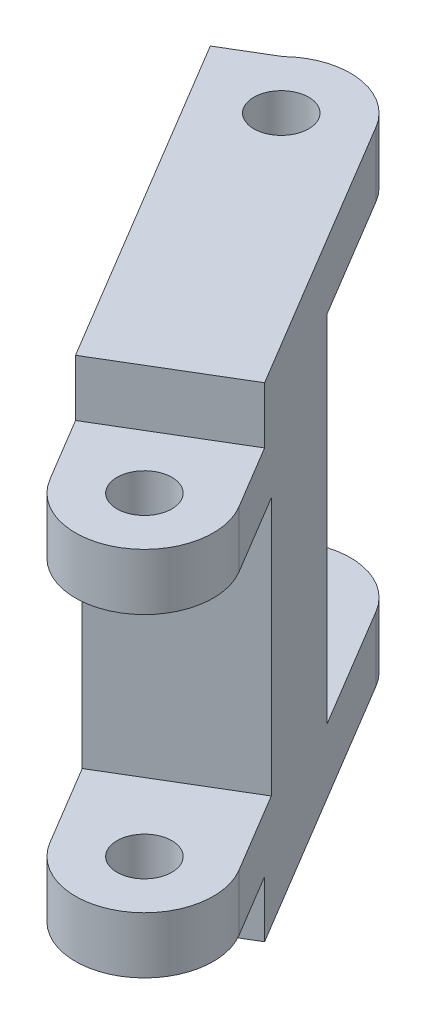
ISO-10303-21;
HEADER;
FILE_DESCRIPTION(('STEP AP214'),'2;1');
FILE_NAME('part.step','',(''),(''),'','','');
FILE_SCHEMA(('AUTOMOTIVE_DESIGN { 1 0 10303 214 1 1 1 1 }'));
ENDSEC;
DATA;
#1=APPLICATION_CONTEXT('core data for automotive mechanical design processes');
#2=APPLICATION_PROTOCOL_DEFINITION('international standard','automotive_design',2000,#1);
#3=PRODUCT_CONTEXT('',#1,'mechanical');
#4=PRODUCT('Part','Part','',(#3));
#5=PRODUCT_RELATED_PRODUCT_CATEGORY('part','',(#4));
#6=PRODUCT_DEFINITION_FORMATION('','',#4);
#7=PRODUCT_DEFINITION_CONTEXT('part definition',#1,'design');
#8=PRODUCT_DEFINITION('design','',#6,#7);
#9=PRODUCT_DEFINITION_SHAPE('','',#8);
#10=(LENGTH_UNIT() NAMED_UNIT(*) SI_UNIT(.MILLI.,.METRE.));
#11=(NAMED_UNIT(*) PLANE_ANGLE_UNIT() SI_UNIT($,.RADIAN.));
#12=(NAMED_UNIT(*) SI_UNIT($,.STERADIAN.) SOLID_ANGLE_UNIT());
#13=UNCERTAINTY_MEASURE_WITH_UNIT(LENGTH_MEASURE(1.E-05),#10,'distance_accuracy_value','');
#14=(GEOMETRIC_REPRESENTATION_CONTEXT(3) GLOBAL_UNCERTAINTY_ASSIGNED_CONTEXT((#13)) GLOBAL_UNIT_ASSIGNED_CONTEXT((#10,
#11,#12)) REPRESENTATION_CONTEXT('',''));
#15=CARTESIAN_POINT('',(0.,0.,0.));
#16=DIRECTION('',(0.,0.,1.));
#17=DIRECTION('',(1.,0.,0.));
#18=AXIS2_PLACEMENT_3D('',#15,#16,#17);
#19=CARTESIAN_POINT('',(-3.11840054835048,30.,-44.5812672091987));
#20=DIRECTION('',(0.,-1.,0.));
#21=DIRECTION('',(0.,0.,-1.));
#22=AXIS2_PLACEMENT_3D('',#19,#20,#21);
#23=CYLINDRICAL_SURFACE('',#22,1.7);
#24=CARTESIAN_POINT('',(-3.11840054835048,26.5,-44.5812672091987));
#25=DIRECTION('',(0.,-1.,0.));
#26=DIRECTION('',(0.,0.,-1.));
#27=AXIS2_PLACEMENT_3D('',#24,#25,#26);
#28=CIRCLE('',#27,1.7);
#29=CARTESIAN_POINT('',(-3.11840054835048,26.5,-46.2812672091987));
#30=VERTEX_POINT('',#29);
#31=EDGE_CURVE('E186',#30,#30,#28,.T.);
#32=ORIENTED_EDGE('',*,*,#31,.F.);
#33=EDGE_LOOP('',(#32));
#34=FACE_BOUND('',#33,.T.);
#35=CARTESIAN_POINT('',(-3.11840054835048,23.,-44.5812672091987));
#36=DIRECTION('',(0.,1.,0.));
#37=DIRECTION('',(0.,0.,1.));
#38=AXIS2_PLACEMENT_3D('',#35,#36,#37);
#39=CIRCLE('',#38,1.7);
#40=CARTESIAN_POINT('',(-3.11840054835048,23.,-42.8812672091987));
#41=VERTEX_POINT('',#40);
#42=EDGE_CURVE('E226',#41,#41,#39,.T.);
#43=ORIENTED_EDGE('',*,*,#42,.F.);
#44=EDGE_LOOP('',(#43));
#45=FACE_BOUND('',#44,.T.);
#46=ADVANCED_FACE('F37',(#34,#45),#23,.F.);
#47=CARTESIAN_POINT('',(-3.11840054835048,30.,-44.5812672091987));
#48=DIRECTION('',(0.,-1.,0.));
#49=DIRECTION('',(0.,0.,-1.));
#50=AXIS2_PLACEMENT_3D('',#47,#48,#49);
#51=CYLINDRICAL_SURFACE('',#50,4.27118158012899);
#52=DIRECTION('',(0.,-1.,0.));
#53=VECTOR('',#52,1.);
#54=CARTESIAN_POINT('',(0.547347337405798,30.,-46.7733631305731));
#55=LINE('',#54,#53);
#56=CARTESIAN_POINT('',(0.547347337405801,26.5,-46.7733631305731));
#57=VERTEX_POINT('',#56);
#58=CARTESIAN_POINT('',(0.547347337405799,23.,-46.7733631305731));
#59=VERTEX_POINT('',#58);
#60=EDGE_CURVE('E291',#57,#59,#55,.T.);
#61=ORIENTED_EDGE('',*,*,#60,.F.);
#62=CARTESIAN_POINT('',(-3.11840054835048,26.5,-44.5812672091987));
#63=DIRECTION('',(0.,-1.,0.));
#64=DIRECTION('',(0.,0.,-1.));
#65=AXIS2_PLACEMENT_3D('',#62,#63,#64);
#66=CIRCLE('',#65,4.27118158012899);
#67=CARTESIAN_POINT('',(-6.78414843410676,26.5,-42.3891712878242));
#68=VERTEX_POINT('',#67);
#69=EDGE_CURVE('E184',#57,#68,#66,.T.);
#70=ORIENTED_EDGE('',*,*,#69,.T.);
#71=DIRECTION('',(0.,-1.,0.));
#72=VECTOR('',#71,1.);
#73=CARTESIAN_POINT('',(-6.78414843410676,30.,-42.3891712878242));
#74=LINE('',#73,#72);
#75=CARTESIAN_POINT('',(-6.78414843410676,23.,-42.3891712878242));
#76=VERTEX_POINT('',#75);
#77=EDGE_CURVE('E179',#68,#76,#74,.T.);
#78=ORIENTED_EDGE('',*,*,#77,.T.);
#79=CARTESIAN_POINT('',(-3.11840054835048,23.,-44.5812672091987));
#80=DIRECTION('',(0.,1.,0.));
#81=DIRECTION('',(0.,0.,1.));
#82=AXIS2_PLACEMENT_3D('',#79,#80,#81);
#83=CIRCLE('',#82,4.27118158012899);
#84=EDGE_CURVE('E314',#76,#59,#83,.T.);
#85=ORIENTED_EDGE('',*,*,#84,.T.);
#86=EDGE_LOOP('',(#61,#70,#78,#85));
#87=FACE_BOUND('',#86,.T.);
#88=ADVANCED_FACE('F399',(#87),#51,.T.);
#89=CARTESIAN_POINT('',(-15.7737708009403,30.,-65.7176303802829));
#90=DIRECTION('',(0.,-1.,0.));
#91=DIRECTION('',(0.,0.,-1.));
#92=AXIS2_PLACEMENT_3D('',#89,#90,#91);
#93=CYLINDRICAL_SURFACE('',#92,4.2848689511232);
#94=CARTESIAN_POINT('',(-15.7737708009403,26.,-65.7176303802829));
#95=DIRECTION('',(0.,-1.,0.));
#96=DIRECTION('',(0.,0.,-1.));
#97=AXIS2_PLACEMENT_3D('',#94,#95,#96);
#98=CIRCLE('',#97,4.2848689511232);
#99=CARTESIAN_POINT('',(-18.7462358249816,26.,-68.8038179327739));
#100=VERTEX_POINT('',#99);
#101=CARTESIAN_POINT('',(-12.0962757088566,26.,-67.9167510627376));
#102=VERTEX_POINT('',#101);
#103=EDGE_CURVE('E249',#100,#102,#98,.T.);
#104=ORIENTED_EDGE('',*,*,#103,.F.);
#105=DIRECTION('',(0.,-1.,0.));
#106=VECTOR('',#105,1.);
#107=CARTESIAN_POINT('',(-18.7462358249816,30.,-68.8038179327739));
#108=LINE('',#107,#106);
#109=CARTESIAN_POINT('',(-18.7462358249816,30.,-68.8038179327739));
#110=VERTEX_POINT('',#109);
#111=EDGE_CURVE('E300',#110,#100,#108,.T.);
#112=ORIENTED_EDGE('',*,*,#111,.F.);
#113=CARTESIAN_POINT('',(-15.7737708009403,30.,-65.7176303802829));
#114=DIRECTION('',(0.,1.,0.));
#115=DIRECTION('',(0.,0.,1.));
#116=AXIS2_PLACEMENT_3D('',#113,#114,#115);
#117=CIRCLE('',#116,4.2848689511232);
#118=CARTESIAN_POINT('',(-12.0962757088566,30.,-67.9167510627376));
#119=VERTEX_POINT('',#118);
#120=EDGE_CURVE('E272',#119,#110,#117,.T.);
#121=ORIENTED_EDGE('',*,*,#120,.F.);
#122=DIRECTION('',(0.,-1.,0.));
#123=VECTOR('',#122,1.);
#124=CARTESIAN_POINT('',(-12.0962757088566,30.,-67.9167510627376));
#125=LINE('',#124,#123);
#126=EDGE_CURVE('E304',#119,#102,#125,.T.);
#127=ORIENTED_EDGE('',*,*,#126,.T.);
#128=EDGE_LOOP('',(#104,#112,#121,#127));
#129=FACE_BOUND('',#128,.T.);
#130=ADVANCED_FACE('F371',(#129),#93,.T.);
#131=CARTESIAN_POINT('',(-35.2445386971406,30.,-58.9379287437799));
#132=DIRECTION('',(-0.513229391036159,0.,-0.858251473739867));
#133=DIRECTION('',(-0.858251473739867,0.,0.513229391036159));
#134=AXIS2_PLACEMENT_3D('',#131,#132,#133);
#135=PLANE('',#134);
#136=ORIENTED_EDGE('',*,*,#111,.T.);
#137=DIRECTION('',(-0.858251473739867,0.,0.513229391036159));
#138=VECTOR('',#137,1.);
#139=CARTESIAN_POINT('',(-35.2445386971406,26.,-58.9379287437799));
#140=LINE('',#139,#138);
#141=CARTESIAN_POINT('',(-21.5701353963567,26.,-67.1151424085145));
#142=VERTEX_POINT('',#141);
#143=EDGE_CURVE('E246',#100,#142,#140,.T.);
#144=ORIENTED_EDGE('',*,*,#143,.T.);
#145=DIRECTION('',(0.,-1.,0.));
#146=VECTOR('',#145,1.);
#147=CARTESIAN_POINT('',(-21.5701353963567,30.,-67.1151424085144));
#148=LINE('',#147,#146);
#149=CARTESIAN_POINT('',(-21.5701353963567,30.,-67.1151424085144));
#150=VERTEX_POINT('',#149);
#151=EDGE_CURVE('E296',#150,#142,#148,.T.);
#152=ORIENTED_EDGE('',*,*,#151,.F.);
#153=DIRECTION('',(0.858251473739867,0.,-0.513229391036159));
#154=VECTOR('',#153,1.);
#155=CARTESIAN_POINT('',(-35.2445386971406,30.,-58.9379287437799));
#156=LINE('',#155,#154);
#157=EDGE_CURVE('E274',#150,#110,#156,.T.);
#158=ORIENTED_EDGE('',*,*,#157,.T.);
#159=EDGE_LOOP('',(#136,#144,#152,#158));
#160=FACE_BOUND('',#159,.T.);
#161=ADVANCED_FACE('F366',(#160),#135,.T.);
#162=CARTESIAN_POINT('',(-15.7737708009403,30.,-65.7176303802829));
#163=DIRECTION('',(0.,-1.,0.));
#164=DIRECTION('',(0.,0.,-1.));
#165=AXIS2_PLACEMENT_3D('',#162,#163,#164);
#166=CYLINDRICAL_SURFACE('',#165,1.7);
#167=CARTESIAN_POINT('',(-15.7737708009403,30.,-65.7176303802829));
#168=DIRECTION('',(0.,1.,0.));
#169=DIRECTION('',(0.,0.,1.));
#170=AXIS2_PLACEMENT_3D('',#167,#168,#169);
#171=CIRCLE('',#170,1.7);
#172=CARTESIAN_POINT('',(-15.7737708009403,30.,-64.0176303802829));
#173=VERTEX_POINT('',#172);
#174=EDGE_CURVE('E266',#173,#173,#171,.T.);
#175=ORIENTED_EDGE('',*,*,#174,.T.);
#176=EDGE_LOOP('',(#175));
#177=FACE_BOUND('',#176,.T.);
#178=CARTESIAN_POINT('',(-15.7737708009403,26.,-65.7176303802829));
#179=DIRECTION('',(0.,-1.,0.));
#180=DIRECTION('',(0.,0.,-1.));
#181=AXIS2_PLACEMENT_3D('',#178,#179,#180);
#182=CIRCLE('',#181,1.7);
#183=CARTESIAN_POINT('',(-15.7737708009403,26.,-67.4176303802829));
#184=VERTEX_POINT('',#183);
#185=EDGE_CURVE('E243',#184,#184,#182,.T.);
#186=ORIENTED_EDGE('',*,*,#185,.T.);
#187=EDGE_LOOP('',(#186));
#188=FACE_BOUND('',#187,.T.);
#189=ADVANCED_FACE('F381',(#177,#188),#166,.F.);
#190=CARTESIAN_POINT('',(21.0058990722965,30.,-12.5614055074834));
#191=DIRECTION('',(-0.858251473739867,0.,0.513229391036159));
#192=DIRECTION('',(0.513229391036159,0.,0.858251473739867));
#193=AXIS2_PLACEMENT_3D('',#190,#191,#192);
#194=PLANE('',#193);
#195=DIRECTION('',(0.,-1.,0.));
#196=VECTOR('',#195,1.);
#197=CARTESIAN_POINT('',(-1.81775136478792,30.,-50.7284161383519));
#198=LINE('',#197,#196);
#199=CARTESIAN_POINT('',(-1.81775136478792,30.,-50.7284161383519));
#200=VERTEX_POINT('',#199);
#201=CARTESIAN_POINT('',(-1.81775136478792,26.5,-50.7284161383519));
#202=VERTEX_POINT('',#201);
#203=EDGE_CURVE('E51',#200,#202,#198,.T.);
#204=ORIENTED_EDGE('',*,*,#203,.T.);
#205=DIRECTION('',(0.513229391036159,0.,0.858251473739867));
#206=VECTOR('',#205,1.);
#207=CARTESIAN_POINT('',(21.0058990722965,26.5,-12.5614055074834));
#208=LINE('',#207,#206);
#209=EDGE_CURVE('E168',#202,#57,#208,.T.);
#210=ORIENTED_EDGE('',*,*,#209,.T.);
#211=ORIENTED_EDGE('',*,*,#60,.T.);
#212=DIRECTION('',(-0.513229391036159,0.,-0.858251473739867));
#213=VECTOR('',#212,1.);
#214=CARTESIAN_POINT('',(21.0058990722965,23.,-12.5614055074834));
#215=LINE('',#214,#213);
#216=CARTESIAN_POINT('',(-2.43436363101253,23.,-51.7595503552464));
#217=VERTEX_POINT('',#216);
#218=EDGE_CURVE('E223',#59,#217,#215,.T.);
#219=ORIENTED_EDGE('',*,*,#218,.T.);
#220=DIRECTION('',(0.,-1.,0.));
#221=VECTOR('',#220,1.);
#222=CARTESIAN_POINT('',(-2.43436363101253,30.,-51.7595503552464));
#223=LINE('',#222,#221);
#224=CARTESIAN_POINT('',(-2.43436363101253,7.,-51.7595503552464));
#225=VERTEX_POINT('',#224);
#226=EDGE_CURVE('E229',#217,#225,#223,.T.);
#227=ORIENTED_EDGE('',*,*,#226,.T.);
#228=DIRECTION('',(0.513229391036159,0.,0.858251473739867));
#229=VECTOR('',#228,1.);
#230=CARTESIAN_POINT('',(21.0058990722965,7.,-12.5614055074834));
#231=LINE('',#230,#229);
#232=CARTESIAN_POINT('',(0.547347337405799,7.,-46.7733631305731));
#233=VERTEX_POINT('',#232);
#234=EDGE_CURVE('E216',#225,#233,#231,.T.);
#235=ORIENTED_EDGE('',*,*,#234,.T.);
#236=CARTESIAN_POINT('',(0.547347337405794,3.5,-46.7733631305731));
#237=VERTEX_POINT('',#236);
#238=EDGE_CURVE('E279',#233,#237,#55,.T.);
#239=ORIENTED_EDGE('',*,*,#238,.T.);
#240=DIRECTION('',(0.513229391036158,0.,0.858251473739867));
#241=VECTOR('',#240,1.);
#242=CARTESIAN_POINT('',(3.39102063143032,3.5,-42.0180103817682));
#243=LINE('',#242,#241);
#244=CARTESIAN_POINT('',(-1.81775136478791,3.5,-50.7284161383518));
#245=VERTEX_POINT('',#244);
#246=EDGE_CURVE('E190',#245,#237,#243,.T.);
#247=ORIENTED_EDGE('',*,*,#246,.F.);
#248=DIRECTION('',(0.,-1.,0.));
#249=VECTOR('',#248,1.);
#250=CARTESIAN_POINT('',(-1.81775136478791,3.5,-50.7284161383518));
#251=LINE('',#250,#249);
#252=CARTESIAN_POINT('',(-1.81775136478791,0.,-50.7284161383518));
#253=VERTEX_POINT('',#252);
#254=EDGE_CURVE('E198',#245,#253,#251,.T.);
#255=ORIENTED_EDGE('',*,*,#254,.T.);
#256=DIRECTION('',(-0.513229391036159,0.,-0.858251473739867));
#257=VECTOR('',#256,1.);
#258=CARTESIAN_POINT('',(21.0058990722965,0.,-12.5614055074834));
#259=LINE('',#258,#257);
#260=CARTESIAN_POINT('',(-12.0962757088566,0.,-67.9167510627376));
#261=VERTEX_POINT('',#260);
#262=EDGE_CURVE('E282',#253,#261,#259,.T.);
#263=ORIENTED_EDGE('',*,*,#262,.T.);
#264=CARTESIAN_POINT('',(-12.0962757088566,4.,-67.9167510627376));
#265=VERTEX_POINT('',#264);
#266=EDGE_CURVE('E303',#265,#261,#125,.T.);
#267=ORIENTED_EDGE('',*,*,#266,.F.);
#268=DIRECTION('',(0.513229391036159,0.,0.858251473739867));
#269=VECTOR('',#268,1.);
#270=CARTESIAN_POINT('',(21.0058990722965,4.,-12.5614055074834));
#271=LINE('',#270,#269);
#272=CARTESIAN_POINT('',(-7.5666575413741,4.,-60.3420650926451));
#273=VERTEX_POINT('',#272);
#274=EDGE_CURVE('E259',#265,#273,#271,.T.);
#275=ORIENTED_EDGE('',*,*,#274,.T.);
#276=DIRECTION('',(0.,1.,0.));
#277=VECTOR('',#276,1.);
#278=CARTESIAN_POINT('',(-7.56665754137411,30.,-60.3420650926451));
#279=LINE('',#278,#277);
#280=CARTESIAN_POINT('',(-7.5666575413741,26.,-60.3420650926451));
#281=VERTEX_POINT('',#280);
#282=EDGE_CURVE('E262',#273,#281,#279,.T.);
#283=ORIENTED_EDGE('',*,*,#282,.T.);
#284=DIRECTION('',(0.513229391036159,0.,0.858251473739867));
#285=VECTOR('',#284,1.);
#286=CARTESIAN_POINT('',(21.0058990722965,26.,-12.5614055074834));
#287=LINE('',#286,#285);
#288=EDGE_CURVE('E251',#102,#281,#287,.T.);
#289=ORIENTED_EDGE('',*,*,#288,.F.);
#290=ORIENTED_EDGE('',*,*,#126,.F.);
#291=DIRECTION('',(-0.513229391036159,0.,-0.858251473739867));
#292=VECTOR('',#291,1.);
#293=CARTESIAN_POINT('',(21.0058990722965,30.,-12.5614055074834));
#294=LINE('',#293,#292);
#295=EDGE_CURVE('E269',#200,#119,#294,.T.);
#296=ORIENTED_EDGE('',*,*,#295,.F.);
#297=EDGE_LOOP('',(#204,#210,#211,#219,#227,#235,#239,#247,#255,#263,#267,#275,#283,#289,#290,#296));
#298=FACE_BOUND('',#297,.T.);
#299=ADVANCED_FACE('F327',(#298),#194,.F.);
#300=CARTESIAN_POINT('',(-18.7462358249816,4.,-68.8038179327739));
#301=VERTEX_POINT('',#300);
#302=CARTESIAN_POINT('',(-18.7462358249816,0.,-68.8038179327739));
#303=VERTEX_POINT('',#302);
#304=EDGE_CURVE('E299',#301,#303,#108,.T.);
#305=ORIENTED_EDGE('',*,*,#304,.F.);
#306=CARTESIAN_POINT('',(-15.7737708009403,4.,-65.7176303802829));
#307=DIRECTION('',(0.,-1.,0.));
#308=DIRECTION('',(0.,0.,-1.));
#309=AXIS2_PLACEMENT_3D('',#306,#307,#308);
#310=CIRCLE('',#309,4.2848689511232);
#311=EDGE_CURVE('E256',#301,#265,#310,.T.);
#312=ORIENTED_EDGE('',*,*,#311,.T.);
#313=ORIENTED_EDGE('',*,*,#266,.T.);
#314=CARTESIAN_POINT('',(-15.7737708009403,0.,-65.7176303802829));
#315=DIRECTION('',(0.,1.,0.));
#316=DIRECTION('',(0.,0.,1.));
#317=AXIS2_PLACEMENT_3D('',#314,#315,#316);
#318=CIRCLE('',#317,4.2848689511232);
#319=EDGE_CURVE('E284',#261,#303,#318,.T.);
#320=ORIENTED_EDGE('',*,*,#319,.T.);
#321=EDGE_LOOP('',(#305,#312,#313,#320));
#322=FACE_BOUND('',#321,.T.);
#323=ADVANCED_FACE('F348',(#322),#93,.T.);
#324=DIRECTION('',(-0.858251473739867,0.,0.513229391036159));
#325=VECTOR('',#324,1.);
#326=CARTESIAN_POINT('',(-35.2445386971406,4.,-58.9379287437799));
#327=LINE('',#326,#325);
#328=CARTESIAN_POINT('',(-21.5701353963567,4.,-67.1151424085145));
#329=VERTEX_POINT('',#328);
#330=EDGE_CURVE('E254',#301,#329,#327,.T.);
#331=ORIENTED_EDGE('',*,*,#330,.F.);
#332=ORIENTED_EDGE('',*,*,#304,.T.);
#333=DIRECTION('',(0.858251473739867,0.,-0.513229391036159));
#334=VECTOR('',#333,1.);
#335=CARTESIAN_POINT('',(-35.2445386971406,0.,-58.9379287437799));
#336=LINE('',#335,#334);
#337=CARTESIAN_POINT('',(-21.5701353963567,0.,-67.1151424085144));
#338=VERTEX_POINT('',#337);
#339=EDGE_CURVE('E287',#338,#303,#336,.T.);
#340=ORIENTED_EDGE('',*,*,#339,.F.);
#341=EDGE_CURVE('E295',#329,#338,#148,.T.);
#342=ORIENTED_EDGE('',*,*,#341,.F.);
#343=EDGE_LOOP('',(#331,#332,#340,#342));
#344=FACE_BOUND('',#343,.T.);
#345=ADVANCED_FACE('F521',(#344),#135,.T.);
#346=CARTESIAN_POINT('',(13.6744033007839,30.,-8.17721366473448));
#347=DIRECTION('',(-0.858251473739867,0.,0.513229391036159));
#348=DIRECTION('',(0.513229391036159,0.,0.858251473739867));
#349=AXIS2_PLACEMENT_3D('',#346,#347,#348);
#350=PLANE('',#349);
#351=DIRECTION('',(0.513229391036159,0.,0.858251473739867));
#352=VECTOR('',#351,1.);
#353=CARTESIAN_POINT('',(-9.14924713630047,26.5,-46.3442242956029));
#354=LINE('',#353,#352);
#355=CARTESIAN_POINT('',(-9.14924713630047,26.5,-46.3442242956029));
#356=VERTEX_POINT('',#355);
#357=EDGE_CURVE('E165',#356,#68,#354,.T.);
#358=ORIENTED_EDGE('',*,*,#357,.F.);
#359=DIRECTION('',(0.,-1.,0.));
#360=VECTOR('',#359,1.);
#361=CARTESIAN_POINT('',(-9.14924713630047,30.,-46.3442242956029));
#362=LINE('',#361,#360);
#363=CARTESIAN_POINT('',(-9.14924713630047,30.,-46.3442242956029));
#364=VERTEX_POINT('',#363);
#365=EDGE_CURVE('E171',#364,#356,#362,.T.);
#366=ORIENTED_EDGE('',*,*,#365,.F.);
#367=DIRECTION('',(-0.513229391036159,0.,-0.858251473739867));
#368=VECTOR('',#367,1.);
#369=CARTESIAN_POINT('',(13.6744033007839,30.,-8.17721366473448));
#370=LINE('',#369,#368);
#371=EDGE_CURVE('E277',#364,#150,#370,.T.);
#372=ORIENTED_EDGE('',*,*,#371,.T.);
#373=ORIENTED_EDGE('',*,*,#151,.T.);
#374=DIRECTION('',(0.513229391036159,0.,0.858251473739867));
#375=VECTOR('',#374,1.);
#376=CARTESIAN_POINT('',(13.6744033007839,26.,-8.17721366473448));
#377=LINE('',#376,#375);
#378=CARTESIAN_POINT('',(-14.8981533128867,26.,-55.9578732498962));
#379=VERTEX_POINT('',#378);
#380=EDGE_CURVE('E237',#142,#379,#377,.T.);
#381=ORIENTED_EDGE('',*,*,#380,.T.);
#382=DIRECTION('',(0.,1.,0.));
#383=VECTOR('',#382,1.);
#384=CARTESIAN_POINT('',(-14.8981533128867,0.,-55.9578732498962));
#385=LINE('',#384,#383);
#386=CARTESIAN_POINT('',(-14.8981533128867,4.,-55.9578732498962));
#387=VERTEX_POINT('',#386);
#388=EDGE_CURVE('E234',#387,#379,#385,.T.);
#389=ORIENTED_EDGE('',*,*,#388,.F.);
#390=DIRECTION('',(0.513229391036159,0.,0.858251473739867));
#391=VECTOR('',#390,1.);
#392=CARTESIAN_POINT('',(13.6744033007839,4.,-8.17721366473448));
#393=LINE('',#392,#391);
#394=EDGE_CURVE('E232',#329,#387,#393,.T.);
#395=ORIENTED_EDGE('',*,*,#394,.F.);
#396=ORIENTED_EDGE('',*,*,#341,.T.);
#397=DIRECTION('',(-0.513229391036159,0.,-0.858251473739867));
#398=VECTOR('',#397,1.);
#399=CARTESIAN_POINT('',(13.6744033007839,0.,-8.17721366473448));
#400=LINE('',#399,#398);
#401=CARTESIAN_POINT('',(-9.14924713630048,0.,-46.3442242956029));
#402=VERTEX_POINT('',#401);
#403=EDGE_CURVE('E270',#402,#338,#400,.T.);
#404=ORIENTED_EDGE('',*,*,#403,.F.);
#405=DIRECTION('',(0.,-1.,0.));
#406=VECTOR('',#405,1.);
#407=CARTESIAN_POINT('',(-9.14924713630047,3.5,-46.3442242956029));
#408=LINE('',#407,#406);
#409=CARTESIAN_POINT('',(-9.14924713630047,3.5,-46.3442242956029));
#410=VERTEX_POINT('',#409);
#411=EDGE_CURVE('E59',#410,#402,#408,.T.);
#412=ORIENTED_EDGE('',*,*,#411,.F.);
#413=DIRECTION('',(-0.513229391036158,0.,-0.858251473739867));
#414=VECTOR('',#413,1.);
#415=CARTESIAN_POINT('',(-9.14924713630047,3.5,-46.3442242956029));
#416=LINE('',#415,#414);
#417=CARTESIAN_POINT('',(-6.78414843410676,3.5,-42.3891712878242));
#418=VERTEX_POINT('',#417);
#419=EDGE_CURVE('E192',#418,#410,#416,.T.);
#420=ORIENTED_EDGE('',*,*,#419,.F.);
#421=CARTESIAN_POINT('',(-6.78414843410676,7.,-42.3891712878242));
#422=VERTEX_POINT('',#421);
#423=EDGE_CURVE('E293',#422,#418,#74,.T.);
#424=ORIENTED_EDGE('',*,*,#423,.F.);
#425=DIRECTION('',(0.513229391036158,0.,0.858251473739867));
#426=VECTOR('',#425,1.);
#427=CARTESIAN_POINT('',(-9.76585940252509,7.,-47.3753585124975));
#428=LINE('',#427,#426);
#429=CARTESIAN_POINT('',(-9.76585940252509,7.,-47.3753585124975));
#430=VERTEX_POINT('',#429);
#431=EDGE_CURVE('E208',#430,#422,#428,.T.);
#432=ORIENTED_EDGE('',*,*,#431,.F.);
#433=DIRECTION('',(0.,-1.,0.));
#434=VECTOR('',#433,1.);
#435=CARTESIAN_POINT('',(-9.76585940252509,7.,-47.3753585124975));
#436=LINE('',#435,#434);
#437=CARTESIAN_POINT('',(-9.76585940252509,23.,-47.3753585124975));
#438=VERTEX_POINT('',#437);
#439=EDGE_CURVE('E205',#438,#430,#436,.T.);
#440=ORIENTED_EDGE('',*,*,#439,.F.);
#441=DIRECTION('',(-0.513229391036158,0.,-0.858251473739867));
#442=VECTOR('',#441,1.);
#443=CARTESIAN_POINT('',(-9.76585940252509,23.,-47.3753585124975));
#444=LINE('',#443,#442);
#445=EDGE_CURVE('E210',#76,#438,#444,.T.);
#446=ORIENTED_EDGE('',*,*,#445,.F.);
#447=ORIENTED_EDGE('',*,*,#77,.F.);
#448=EDGE_LOOP('',(#358,#366,#372,#373,#381,#389,#395,#396,#404,#412,#420,#424,#432,#440,#446,#447));
#449=FACE_BOUND('',#448,.T.);
#450=ADVANCED_FACE('F177',(#449),#350,.T.);
#451=CARTESIAN_POINT('',(-15.7737708009403,4.,-65.7176303802829));
#452=DIRECTION('',(0.,-1.,0.));
#453=DIRECTION('',(0.,0.,-1.));
#454=AXIS2_PLACEMENT_3D('',#451,#452,#453);
#455=CIRCLE('',#454,1.7);
#456=CARTESIAN_POINT('',(-15.7737708009403,4.,-67.4176303802829));
#457=VERTEX_POINT('',#456);
#458=EDGE_CURVE('E253',#457,#457,#455,.T.);
#459=ORIENTED_EDGE('',*,*,#458,.F.);
#460=EDGE_LOOP('',(#459));
#461=FACE_BOUND('',#460,.T.);
#462=CARTESIAN_POINT('',(-15.7737708009403,0.,-65.7176303802829));
#463=DIRECTION('',(0.,1.,0.));
#464=DIRECTION('',(0.,0.,1.));
#465=AXIS2_PLACEMENT_3D('',#462,#463,#464);
#466=CIRCLE('',#465,1.7);
#467=CARTESIAN_POINT('',(-15.7737708009403,0.,-64.0176303802829));
#468=VERTEX_POINT('',#467);
#469=EDGE_CURVE('E265',#468,#468,#466,.T.);
#470=ORIENTED_EDGE('',*,*,#469,.F.);
#471=EDGE_LOOP('',(#470));
#472=FACE_BOUND('',#471,.T.);
#473=ADVANCED_FACE('F384',(#461,#472),#166,.F.);
#474=CARTESIAN_POINT('',(-3.11840054835048,3.5,-44.5812672091987));
#475=DIRECTION('',(0.,1.,0.));
#476=DIRECTION('',(0.,0.,1.));
#477=AXIS2_PLACEMENT_3D('',#474,#475,#476);
#478=CIRCLE('',#477,1.7);
#479=CARTESIAN_POINT('',(-3.11840054835048,3.5,-42.8812672091987));
#480=VERTEX_POINT('',#479);
#481=EDGE_CURVE('E201',#480,#480,#478,.T.);
#482=ORIENTED_EDGE('',*,*,#481,.F.);
#483=EDGE_LOOP('',(#482));
#484=FACE_BOUND('',#483,.T.);
#485=CARTESIAN_POINT('',(-3.11840054835048,7.,-44.5812672091987));
#486=DIRECTION('',(0.,-1.,0.));
#487=DIRECTION('',(0.,0.,-1.));
#488=AXIS2_PLACEMENT_3D('',#485,#486,#487);
#489=CIRCLE('',#488,1.7);
#490=CARTESIAN_POINT('',(-3.11840054835048,7.,-46.2812672091987));
#491=VERTEX_POINT('',#490);
#492=EDGE_CURVE('E220',#491,#491,#489,.T.);
#493=ORIENTED_EDGE('',*,*,#492,.F.);
#494=EDGE_LOOP('',(#493));
#495=FACE_BOUND('',#494,.T.);
#496=ADVANCED_FACE('F39',(#484,#495),#23,.F.);
#497=ORIENTED_EDGE('',*,*,#423,.T.);
#498=CARTESIAN_POINT('',(-3.11840054835048,3.5,-44.5812672091987));
#499=DIRECTION('',(0.,1.,0.));
#500=DIRECTION('',(0.,0.,1.));
#501=AXIS2_PLACEMENT_3D('',#498,#499,#500);
#502=CIRCLE('',#501,4.27118158012899);
#503=EDGE_CURVE('E45',#418,#237,#502,.T.);
#504=ORIENTED_EDGE('',*,*,#503,.T.);
#505=ORIENTED_EDGE('',*,*,#238,.F.);
#506=CARTESIAN_POINT('',(-3.11840054835048,7.,-44.5812672091987));
#507=DIRECTION('',(0.,-1.,0.));
#508=DIRECTION('',(0.,0.,-1.));
#509=AXIS2_PLACEMENT_3D('',#506,#507,#508);
#510=CIRCLE('',#509,4.27118158012899);
#511=EDGE_CURVE('E307',#233,#422,#510,.T.);
#512=ORIENTED_EDGE('',*,*,#511,.T.);
#513=EDGE_LOOP('',(#497,#504,#505,#512));
#514=FACE_BOUND('',#513,.T.);
#515=ADVANCED_FACE('F321',(#514),#51,.T.);
#516=CARTESIAN_POINT('',(0.,30.,0.));
#517=DIRECTION('',(0.,1.,0.));
#518=DIRECTION('',(0.,0.,1.));
#519=AXIS2_PLACEMENT_3D('',#516,#517,#518);
#520=PLANE('',#519);
#521=DIRECTION('',(-0.858251473739867,0.,0.513229391036159));
#522=VECTOR('',#521,1.);
#523=CARTESIAN_POINT('',(-22.8236504370844,30.,-38.1670106308685));
#524=LINE('',#523,#522);
#525=EDGE_CURVE('E11',#200,#364,#524,.T.);
#526=ORIENTED_EDGE('',*,*,#525,.F.);
#527=ORIENTED_EDGE('',*,*,#295,.T.);
#528=ORIENTED_EDGE('',*,*,#120,.T.);
#529=ORIENTED_EDGE('',*,*,#157,.F.);
#530=ORIENTED_EDGE('',*,*,#371,.F.);
#531=EDGE_LOOP('',(#526,#527,#528,#529,#530));
#532=FACE_BOUND('',#531,.T.);
#533=ORIENTED_EDGE('',*,*,#174,.F.);
#534=EDGE_LOOP('',(#533));
#535=FACE_BOUND('',#534,.T.);
#536=ADVANCED_FACE('F375',(#532,#535),#520,.T.);
#537=CARTESIAN_POINT('',(0.,0.,0.));
#538=DIRECTION('',(0.,1.,0.));
#539=DIRECTION('',(0.,0.,1.));
#540=AXIS2_PLACEMENT_3D('',#537,#538,#539);
#541=PLANE('',#540);
#542=ORIENTED_EDGE('',*,*,#469,.T.);
#543=EDGE_LOOP('',(#542));
#544=FACE_BOUND('',#543,.T.);
#545=ORIENTED_EDGE('',*,*,#262,.F.);
#546=DIRECTION('',(0.858251473739867,0.,-0.513229391036158));
#547=VECTOR('',#546,1.);
#548=CARTESIAN_POINT('',(-1.81775136478791,0.,-50.7284161383518));
#549=LINE('',#548,#547);
#550=EDGE_CURVE('E189',#402,#253,#549,.T.);
#551=ORIENTED_EDGE('',*,*,#550,.F.);
#552=ORIENTED_EDGE('',*,*,#403,.T.);
#553=ORIENTED_EDGE('',*,*,#339,.T.);
#554=ORIENTED_EDGE('',*,*,#319,.F.);
#555=EDGE_LOOP('',(#545,#551,#552,#553,#554));
#556=FACE_BOUND('',#555,.T.);
#557=ADVANCED_FACE('F344',(#544,#556),#541,.F.);
#558=CARTESIAN_POINT('',(10.8493908993094,0.,-71.3547549809809));
#559=DIRECTION('',(0.513229391036158,0.,0.858251473739867));
#560=DIRECTION('',(0.858251473739867,0.,-0.513229391036159));
#561=AXIS2_PLACEMENT_3D('',#558,#559,#560);
#562=PLANE('',#561);
#563=DIRECTION('',(-0.858251473739867,0.,0.513229391036158));
#564=VECTOR('',#563,1.);
#565=CARTESIAN_POINT('',(10.8493908993094,4.,-71.3547549809809));
#566=LINE('',#565,#564);
#567=EDGE_CURVE('E240',#273,#387,#566,.T.);
#568=ORIENTED_EDGE('',*,*,#567,.T.);
#569=ORIENTED_EDGE('',*,*,#388,.T.);
#570=DIRECTION('',(-0.858251473739867,0.,0.513229391036158));
#571=VECTOR('',#570,1.);
#572=CARTESIAN_POINT('',(10.8493908993094,26.,-71.3547549809809));
#573=LINE('',#572,#571);
#574=EDGE_CURVE('E241',#281,#379,#573,.T.);
#575=ORIENTED_EDGE('',*,*,#574,.F.);
#576=ORIENTED_EDGE('',*,*,#282,.F.);
#577=EDGE_LOOP('',(#568,#569,#575,#576));
#578=FACE_BOUND('',#577,.T.);
#579=ADVANCED_FACE('F357',(#578),#562,.F.);
#580=CARTESIAN_POINT('',(39.4219475129799,4.,-23.5740953958192));
#581=DIRECTION('',(0.,-1.,0.));
#582=DIRECTION('',(0.,0.,-1.));
#583=AXIS2_PLACEMENT_3D('',#580,#581,#582);
#584=PLANE('',#583);
#585=ORIENTED_EDGE('',*,*,#458,.T.);
#586=EDGE_LOOP('',(#585));
#587=FACE_BOUND('',#586,.T.);
#588=ORIENTED_EDGE('',*,*,#311,.F.);
#589=ORIENTED_EDGE('',*,*,#330,.T.);
#590=ORIENTED_EDGE('',*,*,#394,.T.);
#591=ORIENTED_EDGE('',*,*,#567,.F.);
#592=ORIENTED_EDGE('',*,*,#274,.F.);
#593=EDGE_LOOP('',(#588,#589,#590,#591,#592));
#594=FACE_BOUND('',#593,.T.);
#595=ADVANCED_FACE('F352',(#587,#594),#584,.F.);
#596=CARTESIAN_POINT('',(39.4219475129799,26.,-23.5740953958192));
#597=DIRECTION('',(0.,-1.,0.));
#598=DIRECTION('',(0.,0.,-1.));
#599=AXIS2_PLACEMENT_3D('',#596,#597,#598);
#600=PLANE('',#599);
#601=ORIENTED_EDGE('',*,*,#185,.F.);
#602=EDGE_LOOP('',(#601));
#603=FACE_BOUND('',#602,.T.);
#604=ORIENTED_EDGE('',*,*,#288,.T.);
#605=ORIENTED_EDGE('',*,*,#574,.T.);
#606=ORIENTED_EDGE('',*,*,#380,.F.);
#607=ORIENTED_EDGE('',*,*,#143,.F.);
#608=ORIENTED_EDGE('',*,*,#103,.T.);
#609=EDGE_LOOP('',(#604,#605,#606,#607,#608));
#610=FACE_BOUND('',#609,.T.);
#611=ADVANCED_FACE('F363',(#603,#610),#600,.T.);
#612=CARTESIAN_POINT('',(15.9816848096709,7.,-62.7722402435823));
#613=DIRECTION('',(-0.513229391036158,0.,-0.858251473739867));
#614=DIRECTION('',(-0.858251473739867,0.,0.513229391036159));
#615=AXIS2_PLACEMENT_3D('',#612,#613,#614);
#616=PLANE('',#615);
#617=DIRECTION('',(-0.858251473739867,0.,0.513229391036158));
#618=VECTOR('',#617,1.);
#619=CARTESIAN_POINT('',(15.9816848096709,23.,-62.7722402435823));
#620=LINE('',#619,#618);
#621=EDGE_CURVE('E214',#217,#438,#620,.T.);
#622=ORIENTED_EDGE('',*,*,#621,.T.);
#623=ORIENTED_EDGE('',*,*,#439,.T.);
#624=DIRECTION('',(-0.858251473739867,0.,0.513229391036158));
#625=VECTOR('',#624,1.);
#626=CARTESIAN_POINT('',(15.9816848096709,7.,-62.7722402435823));
#627=LINE('',#626,#625);
#628=EDGE_CURVE('E213',#225,#430,#627,.T.);
#629=ORIENTED_EDGE('',*,*,#628,.F.);
#630=ORIENTED_EDGE('',*,*,#226,.F.);
#631=EDGE_LOOP('',(#622,#623,#629,#630));
#632=FACE_BOUND('',#631,.T.);
#633=ADVANCED_FACE('F332',(#632),#616,.F.);
#634=CARTESIAN_POINT('',(15.9816848096709,23.,-62.7722402435823));
#635=DIRECTION('',(0.,1.,0.));
#636=DIRECTION('',(0.,0.,1.));
#637=AXIS2_PLACEMENT_3D('',#634,#635,#636);
#638=PLANE('',#637);
#639=ORIENTED_EDGE('',*,*,#42,.T.);
#640=EDGE_LOOP('',(#639));
#641=FACE_BOUND('',#640,.T.);
#642=ORIENTED_EDGE('',*,*,#84,.F.);
#643=ORIENTED_EDGE('',*,*,#445,.T.);
#644=ORIENTED_EDGE('',*,*,#621,.F.);
#645=ORIENTED_EDGE('',*,*,#218,.F.);
#646=EDGE_LOOP('',(#642,#643,#644,#645));
#647=FACE_BOUND('',#646,.T.);
#648=ADVANCED_FACE('F393',(#641,#647),#638,.F.);
#649=CARTESIAN_POINT('',(15.9816848096709,7.,-62.7722402435823));
#650=DIRECTION('',(0.,-1.,0.));
#651=DIRECTION('',(0.,0.,-1.));
#652=AXIS2_PLACEMENT_3D('',#649,#650,#651);
#653=PLANE('',#652);
#654=ORIENTED_EDGE('',*,*,#492,.T.);
#655=EDGE_LOOP('',(#654));
#656=FACE_BOUND('',#655,.T.);
#657=ORIENTED_EDGE('',*,*,#628,.T.);
#658=ORIENTED_EDGE('',*,*,#431,.T.);
#659=ORIENTED_EDGE('',*,*,#511,.F.);
#660=ORIENTED_EDGE('',*,*,#234,.F.);
#661=EDGE_LOOP('',(#657,#658,#659,#660));
#662=FACE_BOUND('',#661,.T.);
#663=ADVANCED_FACE('F330',(#656,#662),#653,.F.);
#664=CARTESIAN_POINT('',(0.,3.5,0.));
#665=DIRECTION('',(0.,1.,0.));
#666=DIRECTION('',(0.,0.,1.));
#667=AXIS2_PLACEMENT_3D('',#664,#665,#666);
#668=PLANE('',#667);
#669=ORIENTED_EDGE('',*,*,#481,.T.);
#670=EDGE_LOOP('',(#669));
#671=FACE_BOUND('',#670,.T.);
#672=ORIENTED_EDGE('',*,*,#419,.T.);
#673=DIRECTION('',(0.858251473739867,0.,-0.513229391036158));
#674=VECTOR('',#673,1.);
#675=CARTESIAN_POINT('',(-1.81775136478791,3.5,-50.7284161383518));
#676=LINE('',#675,#674);
#677=EDGE_CURVE('E194',#410,#245,#676,.T.);
#678=ORIENTED_EDGE('',*,*,#677,.T.);
#679=ORIENTED_EDGE('',*,*,#246,.T.);
#680=ORIENTED_EDGE('',*,*,#503,.F.);
#681=EDGE_LOOP('',(#672,#678,#679,#680));
#682=FACE_BOUND('',#681,.T.);
#683=ADVANCED_FACE('F337',(#671,#682),#668,.F.);
#684=CARTESIAN_POINT('',(-1.81775136478791,3.5,-50.7284161383518));
#685=DIRECTION('',(-0.513229391036158,0.,-0.858251473739867));
#686=DIRECTION('',(-0.858251473739867,0.,0.513229391036158));
#687=AXIS2_PLACEMENT_3D('',#684,#685,#686);
#688=PLANE('',#687);
#689=ORIENTED_EDGE('',*,*,#550,.T.);
#690=ORIENTED_EDGE('',*,*,#254,.F.);
#691=ORIENTED_EDGE('',*,*,#677,.F.);
#692=ORIENTED_EDGE('',*,*,#411,.T.);
#693=EDGE_LOOP('',(#689,#690,#691,#692));
#694=FACE_BOUND('',#693,.T.);
#695=ADVANCED_FACE('F338',(#694),#688,.F.);
#696=CARTESIAN_POINT('',(8.86017558050727,26.5,-57.113754365366));
#697=DIRECTION('',(0.,-1.,0.));
#698=DIRECTION('',(0.,0.,-1.));
#699=AXIS2_PLACEMENT_3D('',#696,#697,#698);
#700=PLANE('',#699);
#701=ORIENTED_EDGE('',*,*,#31,.T.);
#702=EDGE_LOOP('',(#701));
#703=FACE_BOUND('',#702,.T.);
#704=ORIENTED_EDGE('',*,*,#209,.F.);
#705=DIRECTION('',(-0.858251473739867,0.,0.513229391036159));
#706=VECTOR('',#705,1.);
#707=CARTESIAN_POINT('',(8.86017558050727,26.5,-57.113754365366));
#708=LINE('',#707,#706);
#709=EDGE_CURVE('E161',#202,#356,#708,.T.);
#710=ORIENTED_EDGE('',*,*,#709,.T.);
#711=ORIENTED_EDGE('',*,*,#357,.T.);
#712=ORIENTED_EDGE('',*,*,#69,.F.);
#713=EDGE_LOOP('',(#704,#710,#711,#712));
#714=FACE_BOUND('',#713,.T.);
#715=ADVANCED_FACE('F163',(#703,#714),#700,.F.);
#716=CARTESIAN_POINT('',(8.86017558050727,30.,-57.113754365366));
#717=DIRECTION('',(-0.513229391036159,0.,-0.858251473739867));
#718=DIRECTION('',(-0.858251473739867,0.,0.513229391036159));
#719=AXIS2_PLACEMENT_3D('',#716,#717,#718);
#720=PLANE('',#719);
#721=ORIENTED_EDGE('',*,*,#525,.T.);
#722=ORIENTED_EDGE('',*,*,#365,.T.);
#723=ORIENTED_EDGE('',*,*,#709,.F.);
#724=ORIENTED_EDGE('',*,*,#203,.F.);
#725=EDGE_LOOP('',(#721,#722,#723,#724));
#726=FACE_BOUND('',#725,.T.);
#727=ADVANCED_FACE('F172',(#726),#720,.F.);
#728=CLOSED_SHELL('',(#46,#88,#130,#161,#189,#299,#323,#345,#450,#473,#496,#515,#536,#557,#579,
#595,#611,#633,#648,#663,#683,#695,#715,#727));
#729=MANIFOLD_SOLID_BREP('B2',#728);
#730=ADVANCED_BREP_SHAPE_REPRESENTATION('',(#18,#729),#14);
#731=SHAPE_DEFINITION_REPRESENTATION(#9,#730);
ENDSEC;
END-ISO-10303-21;
